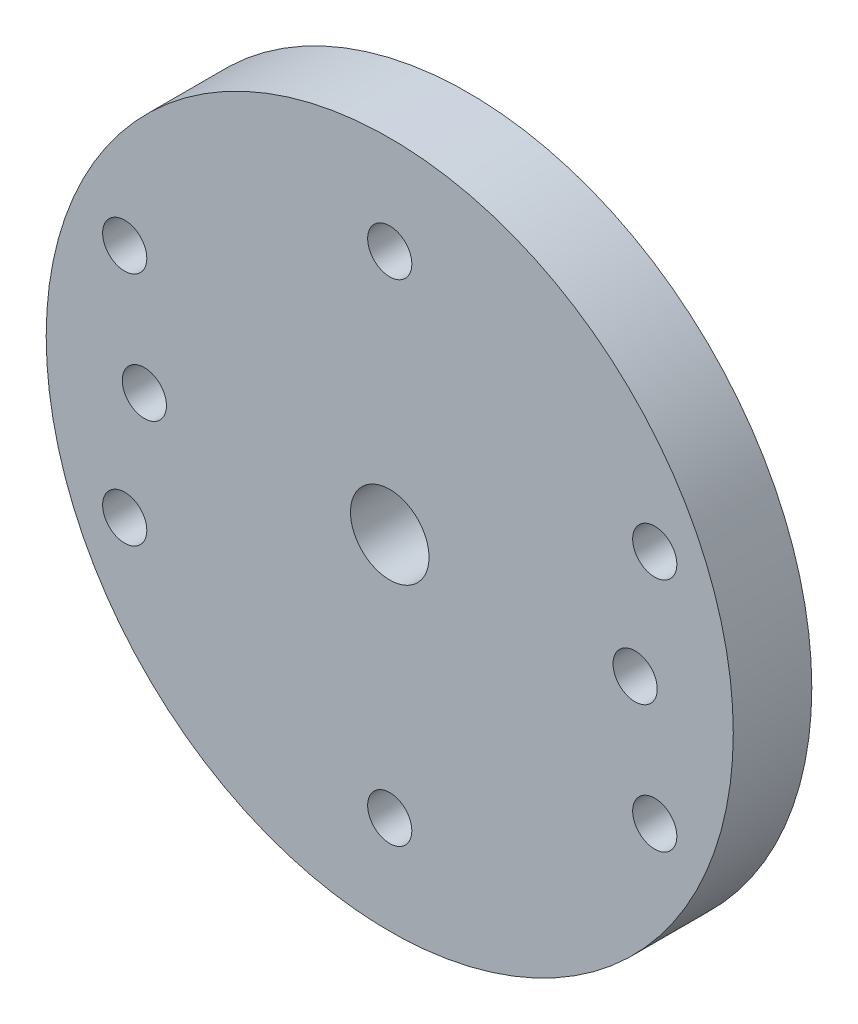
ISO-10303-21;
HEADER;
FILE_DESCRIPTION(('STEP AP214'),'2;1');
FILE_NAME('part.step','',(''),(''),'','','');
FILE_SCHEMA(('AUTOMOTIVE_DESIGN { 1 0 10303 214 1 1 1 1 }'));
ENDSEC;
DATA;
#1=APPLICATION_CONTEXT('core data for automotive mechanical design processes');
#2=APPLICATION_PROTOCOL_DEFINITION('international standard','automotive_design',2000,#1);
#3=PRODUCT_CONTEXT('',#1,'mechanical');
#4=PRODUCT('Part','Part','',(#3));
#5=PRODUCT_RELATED_PRODUCT_CATEGORY('part','',(#4));
#6=PRODUCT_DEFINITION_FORMATION('','',#4);
#7=PRODUCT_DEFINITION_CONTEXT('part definition',#1,'design');
#8=PRODUCT_DEFINITION('design','',#6,#7);
#9=PRODUCT_DEFINITION_SHAPE('','',#8);
#10=(LENGTH_UNIT() NAMED_UNIT(*) SI_UNIT(.MILLI.,.METRE.));
#11=(NAMED_UNIT(*) PLANE_ANGLE_UNIT() SI_UNIT($,.RADIAN.));
#12=(NAMED_UNIT(*) SI_UNIT($,.STERADIAN.) SOLID_ANGLE_UNIT());
#13=UNCERTAINTY_MEASURE_WITH_UNIT(LENGTH_MEASURE(1.E-05),#10,'distance_accuracy_value','');
#14=(GEOMETRIC_REPRESENTATION_CONTEXT(3) GLOBAL_UNCERTAINTY_ASSIGNED_CONTEXT((#13)) GLOBAL_UNIT_ASSIGNED_CONTEXT((#10,
#11,#12)) REPRESENTATION_CONTEXT('',''));
#15=CARTESIAN_POINT('',(0.,0.,0.));
#16=DIRECTION('',(0.,0.,1.));
#17=DIRECTION('',(1.,0.,0.));
#18=AXIS2_PLACEMENT_3D('',#15,#16,#17);
#19=CARTESIAN_POINT('',(8.0245,23.0245,0.02449999999999));
#20=DIRECTION('',(0.,0.,1.));
#21=DIRECTION('',(1.,0.,0.));
#22=AXIS2_PLACEMENT_3D('',#19,#20,#21);
#23=CYLINDRICAL_SURFACE('',#22,4.75);
#24=CARTESIAN_POINT('',(8.0245,23.0245,0.02449999999999));
#25=DIRECTION('',(0.,0.,1.));
#26=DIRECTION('',(1.,0.,0.));
#27=AXIS2_PLACEMENT_3D('',#24,#25,#26);
#28=CIRCLE('',#27,4.75);
#29=CARTESIAN_POINT('',(12.7745,23.0245,0.02449999999999));
#30=VERTEX_POINT('',#29);
#31=EDGE_CURVE('E91',#30,#30,#28,.F.);
#32=ORIENTED_EDGE('',*,*,#31,.T.);
#33=EDGE_LOOP('',(#32));
#34=FACE_BOUND('',#33,.T.);
#35=CARTESIAN_POINT('',(8.0245,23.0245,4.8245));
#36=DIRECTION('',(0.,0.,1.));
#37=DIRECTION('',(1.,0.,0.));
#38=AXIS2_PLACEMENT_3D('',#35,#36,#37);
#39=CIRCLE('',#38,4.75);
#40=CARTESIAN_POINT('',(12.7745,23.0245,4.8245));
#41=VERTEX_POINT('',#40);
#42=EDGE_CURVE('E17',#41,#41,#39,.T.);
#43=ORIENTED_EDGE('',*,*,#42,.T.);
#44=EDGE_LOOP('',(#43));
#45=FACE_BOUND('',#44,.T.);
#46=ADVANCED_FACE('F14',(#34,#45),#23,.F.);
#47=CARTESIAN_POINT('',(62.0245,23.0245,0.02449999999999));
#48=DIRECTION('',(0.,0.,1.));
#49=DIRECTION('',(1.,0.,0.));
#50=AXIS2_PLACEMENT_3D('',#47,#48,#49);
#51=CYLINDRICAL_SURFACE('',#50,4.75);
#52=CARTESIAN_POINT('',(62.0245,23.0245,0.02449999999999));
#53=DIRECTION('',(0.,0.,1.));
#54=DIRECTION('',(1.,0.,0.));
#55=AXIS2_PLACEMENT_3D('',#52,#53,#54);
#56=CIRCLE('',#55,4.75);
#57=CARTESIAN_POINT('',(66.7745,23.0245,0.02449999999999));
#58=VERTEX_POINT('',#57);
#59=EDGE_CURVE('E88',#58,#58,#56,.F.);
#60=ORIENTED_EDGE('',*,*,#59,.T.);
#61=EDGE_LOOP('',(#60));
#62=FACE_BOUND('',#61,.T.);
#63=CARTESIAN_POINT('',(62.0245,23.0245,4.8245));
#64=DIRECTION('',(0.,0.,1.));
#65=DIRECTION('',(1.,0.,0.));
#66=AXIS2_PLACEMENT_3D('',#63,#64,#65);
#67=CIRCLE('',#66,4.75);
#68=CARTESIAN_POINT('',(66.7745,23.0245,4.8245));
#69=VERTEX_POINT('',#68);
#70=EDGE_CURVE('E99',#69,#69,#67,.T.);
#71=ORIENTED_EDGE('',*,*,#70,.T.);
#72=EDGE_LOOP('',(#71));
#73=FACE_BOUND('',#72,.T.);
#74=ADVANCED_FACE('F188',(#62,#73),#51,.F.);
#75=CARTESIAN_POINT('',(8.0245,47.0245,0.02449999999999));
#76=DIRECTION('',(0.,0.,1.));
#77=DIRECTION('',(1.,0.,0.));
#78=AXIS2_PLACEMENT_3D('',#75,#76,#77);
#79=CYLINDRICAL_SURFACE('',#78,4.75);
#80=CARTESIAN_POINT('',(8.0245,47.0245,0.02449999999999));
#81=DIRECTION('',(0.,0.,1.));
#82=DIRECTION('',(1.,0.,0.));
#83=AXIS2_PLACEMENT_3D('',#80,#81,#82);
#84=CIRCLE('',#83,4.75);
#85=CARTESIAN_POINT('',(12.7745,47.0245,0.02449999999999));
#86=VERTEX_POINT('',#85);
#87=EDGE_CURVE('E85',#86,#86,#84,.F.);
#88=ORIENTED_EDGE('',*,*,#87,.T.);
#89=EDGE_LOOP('',(#88));
#90=FACE_BOUND('',#89,.T.);
#91=CARTESIAN_POINT('',(8.0245,47.0245,4.8245));
#92=DIRECTION('',(0.,0.,1.));
#93=DIRECTION('',(1.,0.,0.));
#94=AXIS2_PLACEMENT_3D('',#91,#92,#93);
#95=CIRCLE('',#94,4.75);
#96=CARTESIAN_POINT('',(12.7745,47.0245,4.8245));
#97=VERTEX_POINT('',#96);
#98=EDGE_CURVE('E97',#97,#97,#95,.T.);
#99=ORIENTED_EDGE('',*,*,#98,.T.);
#100=EDGE_LOOP('',(#99));
#101=FACE_BOUND('',#100,.T.);
#102=ADVANCED_FACE('F121',(#90,#101),#79,.F.);
#103=CARTESIAN_POINT('',(62.0245,47.0245,0.02449999999999));
#104=DIRECTION('',(0.,0.,1.));
#105=DIRECTION('',(1.,0.,0.));
#106=AXIS2_PLACEMENT_3D('',#103,#104,#105);
#107=CYLINDRICAL_SURFACE('',#106,4.75);
#108=CARTESIAN_POINT('',(62.0245,47.0245,0.02449999999999));
#109=DIRECTION('',(0.,0.,1.));
#110=DIRECTION('',(1.,0.,0.));
#111=AXIS2_PLACEMENT_3D('',#108,#109,#110);
#112=CIRCLE('',#111,4.75);
#113=CARTESIAN_POINT('',(66.7745,47.0245,0.02449999999999));
#114=VERTEX_POINT('',#113);
#115=EDGE_CURVE('E82',#114,#114,#112,.F.);
#116=ORIENTED_EDGE('',*,*,#115,.T.);
#117=EDGE_LOOP('',(#116));
#118=FACE_BOUND('',#117,.T.);
#119=CARTESIAN_POINT('',(62.0245,47.0245,4.8245));
#120=DIRECTION('',(0.,0.,1.));
#121=DIRECTION('',(1.,0.,0.));
#122=AXIS2_PLACEMENT_3D('',#119,#120,#121);
#123=CIRCLE('',#122,4.75);
#124=CARTESIAN_POINT('',(66.7745,47.0245,4.8245));
#125=VERTEX_POINT('',#124);
#126=EDGE_CURVE('E94',#125,#125,#123,.T.);
#127=ORIENTED_EDGE('',*,*,#126,.T.);
#128=EDGE_LOOP('',(#127));
#129=FACE_BOUND('',#128,.T.);
#130=ADVANCED_FACE('F110',(#118,#129),#107,.F.);
#131=CARTESIAN_POINT('',(8.0245,23.0245,4.8245));
#132=DIRECTION('',(0.,0.,1.));
#133=DIRECTION('',(1.,0.,0.));
#134=AXIS2_PLACEMENT_3D('',#131,#132,#133);
#135=PLANE('',#134);
#136=CARTESIAN_POINT('',(8.0245,23.0245,4.8245));
#137=DIRECTION('',(0.,0.,1.));
#138=DIRECTION('',(1.,0.,0.));
#139=AXIS2_PLACEMENT_3D('',#136,#137,#138);
#140=CIRCLE('',#139,2.25);
#141=CARTESIAN_POINT('',(10.2745,23.0245,4.8245));
#142=VERTEX_POINT('',#141);
#143=EDGE_CURVE('E76',#142,#142,#140,.T.);
#144=ORIENTED_EDGE('',*,*,#143,.T.);
#145=EDGE_LOOP('',(#144));
#146=FACE_BOUND('',#145,.T.);
#147=ORIENTED_EDGE('',*,*,#42,.F.);
#148=EDGE_LOOP('',(#147));
#149=FACE_BOUND('',#148,.T.);
#150=ADVANCED_FACE('F107',(#146,#149),#135,.F.);
#151=CARTESIAN_POINT('',(62.0245,23.0245,4.8245));
#152=DIRECTION('',(0.,0.,1.));
#153=DIRECTION('',(1.,0.,0.));
#154=AXIS2_PLACEMENT_3D('',#151,#152,#153);
#155=PLANE('',#154);
#156=CARTESIAN_POINT('',(62.0245,23.0245,4.8245));
#157=DIRECTION('',(0.,0.,1.));
#158=DIRECTION('',(1.,0.,0.));
#159=AXIS2_PLACEMENT_3D('',#156,#157,#158);
#160=CIRCLE('',#159,2.25);
#161=CARTESIAN_POINT('',(64.2745,23.0245,4.8245));
#162=VERTEX_POINT('',#161);
#163=EDGE_CURVE('E70',#162,#162,#160,.T.);
#164=ORIENTED_EDGE('',*,*,#163,.T.);
#165=EDGE_LOOP('',(#164));
#166=FACE_BOUND('',#165,.T.);
#167=ORIENTED_EDGE('',*,*,#70,.F.);
#168=EDGE_LOOP('',(#167));
#169=FACE_BOUND('',#168,.T.);
#170=ADVANCED_FACE('F109',(#166,#169),#155,.F.);
#171=CARTESIAN_POINT('',(8.0245,47.0245,4.8245));
#172=DIRECTION('',(0.,0.,1.));
#173=DIRECTION('',(1.,0.,0.));
#174=AXIS2_PLACEMENT_3D('',#171,#172,#173);
#175=PLANE('',#174);
#176=CARTESIAN_POINT('',(8.0245,47.0245,4.8245));
#177=DIRECTION('',(0.,0.,1.));
#178=DIRECTION('',(1.,0.,0.));
#179=AXIS2_PLACEMENT_3D('',#176,#177,#178);
#180=CIRCLE('',#179,2.25);
#181=CARTESIAN_POINT('',(10.2745,47.0245,4.8245));
#182=VERTEX_POINT('',#181);
#183=EDGE_CURVE('E64',#182,#182,#180,.T.);
#184=ORIENTED_EDGE('',*,*,#183,.T.);
#185=EDGE_LOOP('',(#184));
#186=FACE_BOUND('',#185,.T.);
#187=ORIENTED_EDGE('',*,*,#98,.F.);
#188=EDGE_LOOP('',(#187));
#189=FACE_BOUND('',#188,.T.);
#190=ADVANCED_FACE('F118',(#186,#189),#175,.F.);
#191=CARTESIAN_POINT('',(62.0245,47.0245,4.8245));
#192=DIRECTION('',(0.,0.,1.));
#193=DIRECTION('',(1.,0.,0.));
#194=AXIS2_PLACEMENT_3D('',#191,#192,#193);
#195=PLANE('',#194);
#196=CARTESIAN_POINT('',(62.0245,47.0245,4.8245));
#197=DIRECTION('',(0.,0.,1.));
#198=DIRECTION('',(1.,0.,0.));
#199=AXIS2_PLACEMENT_3D('',#196,#197,#198);
#200=CIRCLE('',#199,2.25);
#201=CARTESIAN_POINT('',(64.2745,47.0245,4.8245));
#202=VERTEX_POINT('',#201);
#203=EDGE_CURVE('E55',#202,#202,#200,.T.);
#204=ORIENTED_EDGE('',*,*,#203,.T.);
#205=EDGE_LOOP('',(#204));
#206=FACE_BOUND('',#205,.T.);
#207=ORIENTED_EDGE('',*,*,#126,.F.);
#208=EDGE_LOOP('',(#207));
#209=FACE_BOUND('',#208,.T.);
#210=ADVANCED_FACE('F174',(#206,#209),#195,.F.);
#211=CARTESIAN_POINT('',(35.0245,35.0245,0.02449999999999));
#212=DIRECTION('',(0.,0.,1.));
#213=DIRECTION('',(1.,0.,0.));
#214=AXIS2_PLACEMENT_3D('',#211,#212,#213);
#215=PLANE('',#214);
#216=CARTESIAN_POINT('',(35.0245,60.0245,0.02449999999999));
#217=DIRECTION('',(0.,0.,1.));
#218=DIRECTION('',(1.,0.,0.));
#219=AXIS2_PLACEMENT_3D('',#216,#217,#218);
#220=CIRCLE('',#219,2.25);
#221=CARTESIAN_POINT('',(37.2745,60.0245,0.02449999999999));
#222=VERTEX_POINT('',#221);
#223=EDGE_CURVE('E52',#222,#222,#220,.T.);
#224=ORIENTED_EDGE('',*,*,#223,.T.);
#225=EDGE_LOOP('',(#224));
#226=FACE_BOUND('',#225,.T.);
#227=ORIENTED_EDGE('',*,*,#115,.F.);
#228=EDGE_LOOP('',(#227));
#229=FACE_BOUND('',#228,.T.);
#230=CARTESIAN_POINT('',(60.0245,35.0245,0.02449999999999));
#231=DIRECTION('',(0.,0.,1.));
#232=DIRECTION('',(1.,0.,0.));
#233=AXIS2_PLACEMENT_3D('',#230,#231,#232);
#234=CIRCLE('',#233,2.25);
#235=CARTESIAN_POINT('',(62.2745,35.0245,0.02449999999999));
#236=VERTEX_POINT('',#235);
#237=EDGE_CURVE('E58',#236,#236,#234,.T.);
#238=ORIENTED_EDGE('',*,*,#237,.T.);
#239=EDGE_LOOP('',(#238));
#240=FACE_BOUND('',#239,.T.);
#241=CARTESIAN_POINT('',(35.0245,35.0245,0.02449999999999));
#242=DIRECTION('',(0.,0.,1.));
#243=DIRECTION('',(1.,0.,0.));
#244=AXIS2_PLACEMENT_3D('',#241,#242,#243);
#245=CIRCLE('',#244,4.);
#246=CARTESIAN_POINT('',(39.0245,35.0245,0.02449999999999));
#247=VERTEX_POINT('',#246);
#248=EDGE_CURVE('E61',#247,#247,#245,.T.);
#249=ORIENTED_EDGE('',*,*,#248,.T.);
#250=EDGE_LOOP('',(#249));
#251=FACE_BOUND('',#250,.T.);
#252=ORIENTED_EDGE('',*,*,#87,.F.);
#253=EDGE_LOOP('',(#252));
#254=FACE_BOUND('',#253,.T.);
#255=CARTESIAN_POINT('',(10.0245,35.0245,0.02449999999999));
#256=DIRECTION('',(0.,0.,1.));
#257=DIRECTION('',(1.,0.,0.));
#258=AXIS2_PLACEMENT_3D('',#255,#256,#257);
#259=CIRCLE('',#258,2.25);
#260=CARTESIAN_POINT('',(12.2745,35.0245,0.02449999999999));
#261=VERTEX_POINT('',#260);
#262=EDGE_CURVE('E67',#261,#261,#259,.T.);
#263=ORIENTED_EDGE('',*,*,#262,.T.);
#264=EDGE_LOOP('',(#263));
#265=FACE_BOUND('',#264,.T.);
#266=ORIENTED_EDGE('',*,*,#59,.F.);
#267=EDGE_LOOP('',(#266));
#268=FACE_BOUND('',#267,.T.);
#269=CARTESIAN_POINT('',(35.0245,10.0245,0.02449999999999));
#270=DIRECTION('',(0.,0.,1.));
#271=DIRECTION('',(1.,0.,0.));
#272=AXIS2_PLACEMENT_3D('',#269,#270,#271);
#273=CIRCLE('',#272,2.25);
#274=CARTESIAN_POINT('',(37.2745,10.0245,0.02449999999999));
#275=VERTEX_POINT('',#274);
#276=EDGE_CURVE('E73',#275,#275,#273,.T.);
#277=ORIENTED_EDGE('',*,*,#276,.T.);
#278=EDGE_LOOP('',(#277));
#279=FACE_BOUND('',#278,.T.);
#280=ORIENTED_EDGE('',*,*,#31,.F.);
#281=EDGE_LOOP('',(#280));
#282=FACE_BOUND('',#281,.T.);
#283=CARTESIAN_POINT('',(35.0245,35.0245,0.02449999999999));
#284=DIRECTION('',(0.,0.,1.));
#285=DIRECTION('',(1.,0.,0.));
#286=AXIS2_PLACEMENT_3D('',#283,#284,#285);
#287=CIRCLE('',#286,35.);
#288=CARTESIAN_POINT('',(70.0245,35.0245,0.02449999999999));
#289=VERTEX_POINT('',#288);
#290=EDGE_CURVE('E79',#289,#289,#287,.T.);
#291=ORIENTED_EDGE('',*,*,#290,.F.);
#292=EDGE_LOOP('',(#291));
#293=FACE_BOUND('',#292,.T.);
#294=ADVANCED_FACE('F170',(#226,#229,#240,#251,#254,#265,#268,#279,#282,#293),#215,.F.);
#295=CARTESIAN_POINT('',(35.0245,35.0245,0.02449999999999));
#296=DIRECTION('',(0.,0.,1.));
#297=DIRECTION('',(1.,0.,0.));
#298=AXIS2_PLACEMENT_3D('',#295,#296,#297);
#299=CYLINDRICAL_SURFACE('',#298,35.);
#300=ORIENTED_EDGE('',*,*,#290,.T.);
#301=EDGE_LOOP('',(#300));
#302=FACE_BOUND('',#301,.T.);
#303=CARTESIAN_POINT('',(35.0245,35.0245,8.0245));
#304=DIRECTION('',(0.,0.,1.));
#305=DIRECTION('',(1.,0.,0.));
#306=AXIS2_PLACEMENT_3D('',#303,#304,#305);
#307=CIRCLE('',#306,35.);
#308=CARTESIAN_POINT('',(70.0245,35.0245,8.0245));
#309=VERTEX_POINT('',#308);
#310=EDGE_CURVE('E49',#309,#309,#307,.T.);
#311=ORIENTED_EDGE('',*,*,#310,.F.);
#312=EDGE_LOOP('',(#311));
#313=FACE_BOUND('',#312,.T.);
#314=ADVANCED_FACE('F166',(#302,#313),#299,.T.);
#315=CARTESIAN_POINT('',(8.0245,23.0245,0.02449999999999));
#316=DIRECTION('',(0.,0.,1.));
#317=DIRECTION('',(1.,0.,0.));
#318=AXIS2_PLACEMENT_3D('',#315,#316,#317);
#319=CYLINDRICAL_SURFACE('',#318,2.25);
#320=CARTESIAN_POINT('',(8.0245,23.0245,8.0245));
#321=DIRECTION('',(0.,0.,1.));
#322=DIRECTION('',(1.,0.,0.));
#323=AXIS2_PLACEMENT_3D('',#320,#321,#322);
#324=CIRCLE('',#323,2.25);
#325=CARTESIAN_POINT('',(10.2745,23.0245,8.0245));
#326=VERTEX_POINT('',#325);
#327=EDGE_CURVE('E46',#326,#326,#324,.F.);
#328=ORIENTED_EDGE('',*,*,#327,.F.);
#329=EDGE_LOOP('',(#328));
#330=FACE_BOUND('',#329,.T.);
#331=ORIENTED_EDGE('',*,*,#143,.F.);
#332=EDGE_LOOP('',(#331));
#333=FACE_BOUND('',#332,.T.);
#334=ADVANCED_FACE('F162',(#330,#333),#319,.F.);
#335=CARTESIAN_POINT('',(35.0245,10.0245,0.02449999999999));
#336=DIRECTION('',(0.,0.,1.));
#337=DIRECTION('',(1.,0.,0.));
#338=AXIS2_PLACEMENT_3D('',#335,#336,#337);
#339=CYLINDRICAL_SURFACE('',#338,2.25);
#340=ORIENTED_EDGE('',*,*,#276,.F.);
#341=EDGE_LOOP('',(#340));
#342=FACE_BOUND('',#341,.T.);
#343=CARTESIAN_POINT('',(35.0245,10.0245,8.0245));
#344=DIRECTION('',(0.,0.,1.));
#345=DIRECTION('',(1.,0.,0.));
#346=AXIS2_PLACEMENT_3D('',#343,#344,#345);
#347=CIRCLE('',#346,2.25);
#348=CARTESIAN_POINT('',(37.2745,10.0245,8.0245));
#349=VERTEX_POINT('',#348);
#350=EDGE_CURVE('E43',#349,#349,#347,.F.);
#351=ORIENTED_EDGE('',*,*,#350,.F.);
#352=EDGE_LOOP('',(#351));
#353=FACE_BOUND('',#352,.T.);
#354=ADVANCED_FACE('F158',(#342,#353),#339,.F.);
#355=CARTESIAN_POINT('',(62.0245,23.0245,0.02449999999999));
#356=DIRECTION('',(0.,0.,1.));
#357=DIRECTION('',(1.,0.,0.));
#358=AXIS2_PLACEMENT_3D('',#355,#356,#357);
#359=CYLINDRICAL_SURFACE('',#358,2.25);
#360=CARTESIAN_POINT('',(62.0245,23.0245,8.0245));
#361=DIRECTION('',(0.,0.,1.));
#362=DIRECTION('',(1.,0.,0.));
#363=AXIS2_PLACEMENT_3D('',#360,#361,#362);
#364=CIRCLE('',#363,2.25);
#365=CARTESIAN_POINT('',(64.2745,23.0245,8.0245));
#366=VERTEX_POINT('',#365);
#367=EDGE_CURVE('E40',#366,#366,#364,.F.);
#368=ORIENTED_EDGE('',*,*,#367,.F.);
#369=EDGE_LOOP('',(#368));
#370=FACE_BOUND('',#369,.T.);
#371=ORIENTED_EDGE('',*,*,#163,.F.);
#372=EDGE_LOOP('',(#371));
#373=FACE_BOUND('',#372,.T.);
#374=ADVANCED_FACE('F154',(#370,#373),#359,.F.);
#375=CARTESIAN_POINT('',(10.0245,35.0245,0.02449999999999));
#376=DIRECTION('',(0.,0.,1.));
#377=DIRECTION('',(1.,0.,0.));
#378=AXIS2_PLACEMENT_3D('',#375,#376,#377);
#379=CYLINDRICAL_SURFACE('',#378,2.25);
#380=ORIENTED_EDGE('',*,*,#262,.F.);
#381=EDGE_LOOP('',(#380));
#382=FACE_BOUND('',#381,.T.);
#383=CARTESIAN_POINT('',(10.0245,35.0245,8.0245));
#384=DIRECTION('',(0.,0.,1.));
#385=DIRECTION('',(1.,0.,0.));
#386=AXIS2_PLACEMENT_3D('',#383,#384,#385);
#387=CIRCLE('',#386,2.25);
#388=CARTESIAN_POINT('',(12.2745,35.0245,8.0245));
#389=VERTEX_POINT('',#388);
#390=EDGE_CURVE('E37',#389,#389,#387,.F.);
#391=ORIENTED_EDGE('',*,*,#390,.F.);
#392=EDGE_LOOP('',(#391));
#393=FACE_BOUND('',#392,.T.);
#394=ADVANCED_FACE('F150',(#382,#393),#379,.F.);
#395=CARTESIAN_POINT('',(8.0245,47.0245,0.02449999999999));
#396=DIRECTION('',(0.,0.,1.));
#397=DIRECTION('',(1.,0.,0.));
#398=AXIS2_PLACEMENT_3D('',#395,#396,#397);
#399=CYLINDRICAL_SURFACE('',#398,2.25);
#400=CARTESIAN_POINT('',(8.0245,47.0245,8.0245));
#401=DIRECTION('',(0.,0.,1.));
#402=DIRECTION('',(1.,0.,0.));
#403=AXIS2_PLACEMENT_3D('',#400,#401,#402);
#404=CIRCLE('',#403,2.25);
#405=CARTESIAN_POINT('',(10.2745,47.0245,8.0245));
#406=VERTEX_POINT('',#405);
#407=EDGE_CURVE('E34',#406,#406,#404,.F.);
#408=ORIENTED_EDGE('',*,*,#407,.F.);
#409=EDGE_LOOP('',(#408));
#410=FACE_BOUND('',#409,.T.);
#411=ORIENTED_EDGE('',*,*,#183,.F.);
#412=EDGE_LOOP('',(#411));
#413=FACE_BOUND('',#412,.T.);
#414=ADVANCED_FACE('F146',(#410,#413),#399,.F.);
#415=CARTESIAN_POINT('',(35.0245,35.0245,0.02449999999999));
#416=DIRECTION('',(0.,0.,1.));
#417=DIRECTION('',(1.,0.,0.));
#418=AXIS2_PLACEMENT_3D('',#415,#416,#417);
#419=CYLINDRICAL_SURFACE('',#418,4.);
#420=ORIENTED_EDGE('',*,*,#248,.F.);
#421=EDGE_LOOP('',(#420));
#422=FACE_BOUND('',#421,.T.);
#423=CARTESIAN_POINT('',(35.0245,35.0245,8.0245));
#424=DIRECTION('',(0.,0.,1.));
#425=DIRECTION('',(1.,0.,0.));
#426=AXIS2_PLACEMENT_3D('',#423,#424,#425);
#427=CIRCLE('',#426,4.);
#428=CARTESIAN_POINT('',(39.0245,35.0245,8.0245));
#429=VERTEX_POINT('',#428);
#430=EDGE_CURVE('E31',#429,#429,#427,.F.);
#431=ORIENTED_EDGE('',*,*,#430,.F.);
#432=EDGE_LOOP('',(#431));
#433=FACE_BOUND('',#432,.T.);
#434=ADVANCED_FACE('F142',(#422,#433),#419,.F.);
#435=CARTESIAN_POINT('',(60.0245,35.0245,0.02449999999999));
#436=DIRECTION('',(0.,0.,1.));
#437=DIRECTION('',(1.,0.,0.));
#438=AXIS2_PLACEMENT_3D('',#435,#436,#437);
#439=CYLINDRICAL_SURFACE('',#438,2.25);
#440=ORIENTED_EDGE('',*,*,#237,.F.);
#441=EDGE_LOOP('',(#440));
#442=FACE_BOUND('',#441,.T.);
#443=CARTESIAN_POINT('',(60.0245,35.0245,8.0245));
#444=DIRECTION('',(0.,0.,1.));
#445=DIRECTION('',(1.,0.,0.));
#446=AXIS2_PLACEMENT_3D('',#443,#444,#445);
#447=CIRCLE('',#446,2.25);
#448=CARTESIAN_POINT('',(62.2745,35.0245,8.0245));
#449=VERTEX_POINT('',#448);
#450=EDGE_CURVE('E26',#449,#449,#447,.F.);
#451=ORIENTED_EDGE('',*,*,#450,.F.);
#452=EDGE_LOOP('',(#451));
#453=FACE_BOUND('',#452,.T.);
#454=ADVANCED_FACE('F138',(#442,#453),#439,.F.);
#455=CARTESIAN_POINT('',(62.0245,47.0245,0.02449999999999));
#456=DIRECTION('',(0.,0.,1.));
#457=DIRECTION('',(1.,0.,0.));
#458=AXIS2_PLACEMENT_3D('',#455,#456,#457);
#459=CYLINDRICAL_SURFACE('',#458,2.25);
#460=CARTESIAN_POINT('',(62.0245,47.0245,8.0245));
#461=DIRECTION('',(0.,0.,1.));
#462=DIRECTION('',(1.,0.,0.));
#463=AXIS2_PLACEMENT_3D('',#460,#461,#462);
#464=CIRCLE('',#463,2.25);
#465=CARTESIAN_POINT('',(64.2745,47.0245,8.0245));
#466=VERTEX_POINT('',#465);
#467=EDGE_CURVE('E21',#466,#466,#464,.F.);
#468=ORIENTED_EDGE('',*,*,#467,.F.);
#469=EDGE_LOOP('',(#468));
#470=FACE_BOUND('',#469,.T.);
#471=ORIENTED_EDGE('',*,*,#203,.F.);
#472=EDGE_LOOP('',(#471));
#473=FACE_BOUND('',#472,.T.);
#474=ADVANCED_FACE('F131',(#470,#473),#459,.F.);
#475=CARTESIAN_POINT('',(35.0245,60.0245,0.02449999999999));
#476=DIRECTION('',(0.,0.,1.));
#477=DIRECTION('',(1.,0.,0.));
#478=AXIS2_PLACEMENT_3D('',#475,#476,#477);
#479=CYLINDRICAL_SURFACE('',#478,2.25);
#480=ORIENTED_EDGE('',*,*,#223,.F.);
#481=EDGE_LOOP('',(#480));
#482=FACE_BOUND('',#481,.T.);
#483=CARTESIAN_POINT('',(35.0245,60.0245,8.0245));
#484=DIRECTION('',(0.,0.,1.));
#485=DIRECTION('',(1.,0.,0.));
#486=AXIS2_PLACEMENT_3D('',#483,#484,#485);
#487=CIRCLE('',#486,2.25);
#488=CARTESIAN_POINT('',(37.2745,60.0245,8.0245));
#489=VERTEX_POINT('',#488);
#490=EDGE_CURVE('E10',#489,#489,#487,.F.);
#491=ORIENTED_EDGE('',*,*,#490,.F.);
#492=EDGE_LOOP('',(#491));
#493=FACE_BOUND('',#492,.T.);
#494=ADVANCED_FACE('F126',(#482,#493),#479,.F.);
#495=CARTESIAN_POINT('',(35.0245,35.0245,8.0245));
#496=DIRECTION('',(0.,0.,1.));
#497=DIRECTION('',(1.,0.,0.));
#498=AXIS2_PLACEMENT_3D('',#495,#496,#497);
#499=PLANE('',#498);
#500=ORIENTED_EDGE('',*,*,#490,.T.);
#501=EDGE_LOOP('',(#500));
#502=FACE_BOUND('',#501,.T.);
#503=ORIENTED_EDGE('',*,*,#467,.T.);
#504=EDGE_LOOP('',(#503));
#505=FACE_BOUND('',#504,.T.);
#506=ORIENTED_EDGE('',*,*,#450,.T.);
#507=EDGE_LOOP('',(#506));
#508=FACE_BOUND('',#507,.T.);
#509=ORIENTED_EDGE('',*,*,#430,.T.);
#510=EDGE_LOOP('',(#509));
#511=FACE_BOUND('',#510,.T.);
#512=ORIENTED_EDGE('',*,*,#407,.T.);
#513=EDGE_LOOP('',(#512));
#514=FACE_BOUND('',#513,.T.);
#515=ORIENTED_EDGE('',*,*,#390,.T.);
#516=EDGE_LOOP('',(#515));
#517=FACE_BOUND('',#516,.T.);
#518=ORIENTED_EDGE('',*,*,#367,.T.);
#519=EDGE_LOOP('',(#518));
#520=FACE_BOUND('',#519,.T.);
#521=ORIENTED_EDGE('',*,*,#350,.T.);
#522=EDGE_LOOP('',(#521));
#523=FACE_BOUND('',#522,.T.);
#524=ORIENTED_EDGE('',*,*,#327,.T.);
#525=EDGE_LOOP('',(#524));
#526=FACE_BOUND('',#525,.T.);
#527=ORIENTED_EDGE('',*,*,#310,.T.);
#528=EDGE_LOOP('',(#527));
#529=FACE_BOUND('',#528,.T.);
#530=ADVANCED_FACE('F124',(#502,#505,#508,#511,#514,#517,#520,#523,#526,#529),#499,.T.);
#531=CLOSED_SHELL('',(#46,#74,#102,#130,#150,#170,#190,#210,#294,#314,#334,#354,#374,#394,#414,
#434,#454,#474,#494,#530));
#532=MANIFOLD_SOLID_BREP('B1',#531);
#533=ADVANCED_BREP_SHAPE_REPRESENTATION('',(#18,#532),#14);
#534=SHAPE_DEFINITION_REPRESENTATION(#9,#533);
ENDSEC;
END-ISO-10303-21;
